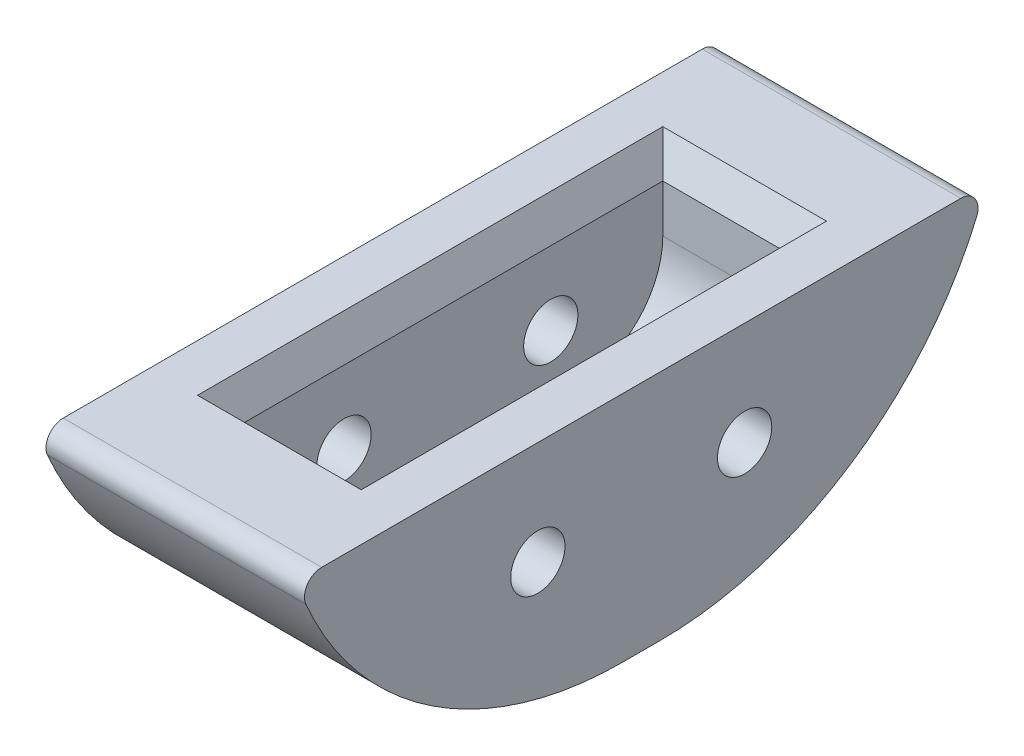
ISO-10303-21;
HEADER;
FILE_DESCRIPTION(('STEP AP214'),'2;1');
FILE_NAME('part.step','',(''),(''),'','','');
FILE_SCHEMA(('AUTOMOTIVE_DESIGN { 1 0 10303 214 1 1 1 1 }'));
ENDSEC;
DATA;
#1=APPLICATION_CONTEXT('core data for automotive mechanical design processes');
#2=APPLICATION_PROTOCOL_DEFINITION('international standard','automotive_design',2000,#1);
#3=PRODUCT_CONTEXT('',#1,'mechanical');
#4=PRODUCT('Part','Part','',(#3));
#5=PRODUCT_RELATED_PRODUCT_CATEGORY('part','',(#4));
#6=PRODUCT_DEFINITION_FORMATION('','',#4);
#7=PRODUCT_DEFINITION_CONTEXT('part definition',#1,'design');
#8=PRODUCT_DEFINITION('design','',#6,#7);
#9=PRODUCT_DEFINITION_SHAPE('','',#8);
#10=(LENGTH_UNIT() NAMED_UNIT(*) SI_UNIT(.MILLI.,.METRE.));
#11=(NAMED_UNIT(*) PLANE_ANGLE_UNIT() SI_UNIT($,.RADIAN.));
#12=(NAMED_UNIT(*) SI_UNIT($,.STERADIAN.) SOLID_ANGLE_UNIT());
#13=UNCERTAINTY_MEASURE_WITH_UNIT(LENGTH_MEASURE(1.E-05),#10,'distance_accuracy_value','');
#14=(GEOMETRIC_REPRESENTATION_CONTEXT(3) GLOBAL_UNCERTAINTY_ASSIGNED_CONTEXT((#13)) GLOBAL_UNIT_ASSIGNED_CONTEXT((#10,
#11,#12)) REPRESENTATION_CONTEXT('',''));
#15=CARTESIAN_POINT('',(0.,0.,0.));
#16=DIRECTION('',(0.,0.,1.));
#17=DIRECTION('',(1.,0.,0.));
#18=AXIS2_PLACEMENT_3D('',#15,#16,#17);
#19=CARTESIAN_POINT('',(-25.,15.,-12.));
#20=DIRECTION('',(1.,0.,0.));
#21=DIRECTION('',(0.,0.,-1.));
#22=AXIS2_PLACEMENT_3D('',#19,#20,#21);
#23=CYLINDRICAL_SURFACE('',#22,3.15);
#24=CARTESIAN_POINT('',(-7.5,15.,-12.));
#25=DIRECTION('',(-1.,0.,0.));
#26=DIRECTION('',(0.,0.,1.));
#27=AXIS2_PLACEMENT_3D('',#24,#25,#26);
#28=CIRCLE('',#27,3.15);
#29=CARTESIAN_POINT('',(-7.5,15.,-8.85));
#30=VERTEX_POINT('',#29);
#31=EDGE_CURVE('E214',#30,#30,#28,.T.);
#32=ORIENTED_EDGE('',*,*,#31,.F.);
#33=EDGE_LOOP('',(#32));
#34=FACE_BOUND('',#33,.T.);
#35=CARTESIAN_POINT('',(-15.,15.,-12.));
#36=DIRECTION('',(-1.,0.,0.));
#37=DIRECTION('',(0.,0.,1.));
#38=AXIS2_PLACEMENT_3D('',#35,#36,#37);
#39=CIRCLE('',#38,3.15);
#40=CARTESIAN_POINT('',(-15.,15.,-8.85));
#41=VERTEX_POINT('',#40);
#42=EDGE_CURVE('E286',#41,#41,#39,.F.);
#43=ORIENTED_EDGE('',*,*,#42,.F.);
#44=EDGE_LOOP('',(#43));
#45=FACE_BOUND('',#44,.T.);
#46=ADVANCED_FACE('F42',(#34,#45),#23,.F.);
#47=CARTESIAN_POINT('',(-25.,15.,12.));
#48=DIRECTION('',(1.,0.,0.));
#49=DIRECTION('',(0.,0.,-1.));
#50=AXIS2_PLACEMENT_3D('',#47,#48,#49);
#51=CYLINDRICAL_SURFACE('',#50,3.15);
#52=CARTESIAN_POINT('',(-7.5,15.,12.));
#53=DIRECTION('',(-1.,0.,0.));
#54=DIRECTION('',(0.,0.,1.));
#55=AXIS2_PLACEMENT_3D('',#52,#53,#54);
#56=CIRCLE('',#55,3.15);
#57=CARTESIAN_POINT('',(-7.5,15.,15.15));
#58=VERTEX_POINT('',#57);
#59=EDGE_CURVE('E211',#58,#58,#56,.F.);
#60=ORIENTED_EDGE('',*,*,#59,.T.);
#61=EDGE_LOOP('',(#60));
#62=FACE_BOUND('',#61,.T.);
#63=CARTESIAN_POINT('',(-15.,15.,12.));
#64=DIRECTION('',(-1.,0.,0.));
#65=DIRECTION('',(0.,0.,1.));
#66=AXIS2_PLACEMENT_3D('',#63,#64,#65);
#67=CIRCLE('',#66,3.15);
#68=CARTESIAN_POINT('',(-15.,15.,15.15));
#69=VERTEX_POINT('',#68);
#70=EDGE_CURVE('E182',#69,#69,#67,.T.);
#71=ORIENTED_EDGE('',*,*,#70,.T.);
#72=EDGE_LOOP('',(#71));
#73=FACE_BOUND('',#72,.T.);
#74=ADVANCED_FACE('F296',(#62,#73),#51,.F.);
#75=CARTESIAN_POINT('',(15.,27.,40.));
#76=DIRECTION('',(-1.,0.,0.));
#77=DIRECTION('',(0.,0.,1.));
#78=AXIS2_PLACEMENT_3D('',#75,#76,#77);
#79=PLANE('',#78);
#80=DIRECTION('',(0.,0.,-1.));
#81=VECTOR('',#80,1.);
#82=CARTESIAN_POINT('',(15.,27.,40.));
#83=LINE('',#82,#81);
#84=CARTESIAN_POINT('',(15.,27.,37.0856198614367));
#85=VERTEX_POINT('',#84);
#86=CARTESIAN_POINT('',(15.,27.,-37.0856198614367));
#87=VERTEX_POINT('',#86);
#88=EDGE_CURVE('E171',#85,#87,#83,.T.);
#89=ORIENTED_EDGE('',*,*,#88,.F.);
#90=CARTESIAN_POINT('',(15.,25.,37.0856198614367));
#91=DIRECTION('',(-1.,0.,0.));
#92=DIRECTION('',(0.,0.,1.));
#93=AXIS2_PLACEMENT_3D('',#90,#91,#92);
#94=CIRCLE('',#93,2.);
#95=CARTESIAN_POINT('',(15.,24.2105263157895,38.9232083088152));
#96=VERTEX_POINT('',#95);
#97=EDGE_CURVE('E199',#85,#96,#94,.F.);
#98=ORIENTED_EDGE('',*,*,#97,.T.);
#99=CARTESIAN_POINT('',(15.,40.,2.17143936124452));
#100=DIRECTION('',(-1.,0.,0.));
#101=DIRECTION('',(0.,0.,1.));
#102=AXIS2_PLACEMENT_3D('',#99,#100,#101);
#103=CIRCLE('',#102,40.);
#104=CARTESIAN_POINT('',(15.,0.,2.17143936124452));
#105=VERTEX_POINT('',#104);
#106=EDGE_CURVE('E161',#96,#105,#103,.F.);
#107=ORIENTED_EDGE('',*,*,#106,.T.);
#108=DIRECTION('',(0.,0.,-1.));
#109=VECTOR('',#108,1.);
#110=CARTESIAN_POINT('',(15.,0.,40.));
#111=LINE('',#110,#109);
#112=CARTESIAN_POINT('',(15.,0.,-2.17143936124452));
#113=VERTEX_POINT('',#112);
#114=EDGE_CURVE('E172',#105,#113,#111,.T.);
#115=ORIENTED_EDGE('',*,*,#114,.T.);
#116=CARTESIAN_POINT('',(15.,40.,-2.17143936124452));
#117=DIRECTION('',(-1.,0.,0.));
#118=DIRECTION('',(0.,0.,1.));
#119=AXIS2_PLACEMENT_3D('',#116,#117,#118);
#120=CIRCLE('',#119,40.);
#121=CARTESIAN_POINT('',(15.,24.2105263157895,-38.9232083088152));
#122=VERTEX_POINT('',#121);
#123=EDGE_CURVE('E162',#113,#122,#120,.F.);
#124=ORIENTED_EDGE('',*,*,#123,.T.);
#125=CARTESIAN_POINT('',(15.,25.,-37.0856198614367));
#126=DIRECTION('',(-1.,0.,0.));
#127=DIRECTION('',(0.,0.,1.));
#128=AXIS2_PLACEMENT_3D('',#125,#126,#127);
#129=CIRCLE('',#128,2.);
#130=EDGE_CURVE('E191',#122,#87,#129,.F.);
#131=ORIENTED_EDGE('',*,*,#130,.T.);
#132=EDGE_LOOP('',(#89,#98,#107,#115,#124,#131));
#133=FACE_BOUND('',#132,.T.);
#134=CARTESIAN_POINT('',(15.,15.,-12.));
#135=DIRECTION('',(-1.,0.,0.));
#136=DIRECTION('',(0.,0.,1.));
#137=AXIS2_PLACEMENT_3D('',#134,#135,#136);
#138=CIRCLE('',#137,3.15);
#139=CARTESIAN_POINT('',(15.,15.,-8.85));
#140=VERTEX_POINT('',#139);
#141=EDGE_CURVE('E282',#140,#140,#138,.T.);
#142=ORIENTED_EDGE('',*,*,#141,.T.);
#143=EDGE_LOOP('',(#142));
#144=FACE_BOUND('',#143,.T.);
#145=CARTESIAN_POINT('',(15.,15.,12.));
#146=DIRECTION('',(1.,0.,0.));
#147=DIRECTION('',(0.,0.,-1.));
#148=AXIS2_PLACEMENT_3D('',#145,#146,#147);
#149=CIRCLE('',#148,3.15);
#150=CARTESIAN_POINT('',(15.,15.,8.85));
#151=VERTEX_POINT('',#150);
#152=EDGE_CURVE('E283',#151,#151,#149,.T.);
#153=ORIENTED_EDGE('',*,*,#152,.F.);
#154=EDGE_LOOP('',(#153));
#155=FACE_BOUND('',#154,.T.);
#156=ADVANCED_FACE('F300',(#133,#144,#155),#79,.F.);
#157=CARTESIAN_POINT('',(-15.,27.,40.));
#158=DIRECTION('',(-1.,0.,0.));
#159=DIRECTION('',(0.,0.,1.));
#160=AXIS2_PLACEMENT_3D('',#157,#158,#159);
#161=PLANE('',#160);
#162=CARTESIAN_POINT('',(-15.,25.,37.0856198614367));
#163=DIRECTION('',(-1.,0.,0.));
#164=DIRECTION('',(0.,0.,1.));
#165=AXIS2_PLACEMENT_3D('',#162,#163,#164);
#166=CIRCLE('',#165,2.);
#167=CARTESIAN_POINT('',(-15.,24.2105263157895,38.9232083088152));
#168=VERTEX_POINT('',#167);
#169=CARTESIAN_POINT('',(-15.,27.,37.0856198614367));
#170=VERTEX_POINT('',#169);
#171=EDGE_CURVE('E203',#168,#170,#166,.T.);
#172=ORIENTED_EDGE('',*,*,#171,.T.);
#173=DIRECTION('',(0.,0.,-1.));
#174=VECTOR('',#173,1.);
#175=CARTESIAN_POINT('',(-15.,27.,40.));
#176=LINE('',#175,#174);
#177=CARTESIAN_POINT('',(-15.,27.,-37.0856198614367));
#178=VERTEX_POINT('',#177);
#179=EDGE_CURVE('E177',#170,#178,#176,.T.);
#180=ORIENTED_EDGE('',*,*,#179,.T.);
#181=CARTESIAN_POINT('',(-15.,25.,-37.0856198614367));
#182=DIRECTION('',(-1.,0.,0.));
#183=DIRECTION('',(0.,0.,1.));
#184=AXIS2_PLACEMENT_3D('',#181,#182,#183);
#185=CIRCLE('',#184,2.);
#186=CARTESIAN_POINT('',(-15.,24.2105263157895,-38.9232083088152));
#187=VERTEX_POINT('',#186);
#188=EDGE_CURVE('E156',#178,#187,#185,.T.);
#189=ORIENTED_EDGE('',*,*,#188,.T.);
#190=CARTESIAN_POINT('',(-15.,40.,-2.17143936124452));
#191=DIRECTION('',(-1.,0.,0.));
#192=DIRECTION('',(0.,0.,1.));
#193=AXIS2_PLACEMENT_3D('',#190,#191,#192);
#194=CIRCLE('',#193,40.);
#195=CARTESIAN_POINT('',(-15.,0.,-2.17143936124452));
#196=VERTEX_POINT('',#195);
#197=EDGE_CURVE('E146',#187,#196,#194,.T.);
#198=ORIENTED_EDGE('',*,*,#197,.T.);
#199=DIRECTION('',(0.,0.,-1.));
#200=VECTOR('',#199,1.);
#201=CARTESIAN_POINT('',(-15.,0.,40.));
#202=LINE('',#201,#200);
#203=CARTESIAN_POINT('',(-15.,0.,2.17143936124452));
#204=VERTEX_POINT('',#203);
#205=EDGE_CURVE('E152',#204,#196,#202,.T.);
#206=ORIENTED_EDGE('',*,*,#205,.F.);
#207=CARTESIAN_POINT('',(-15.,40.,2.17143936124452));
#208=DIRECTION('',(-1.,0.,0.));
#209=DIRECTION('',(0.,0.,1.));
#210=AXIS2_PLACEMENT_3D('',#207,#208,#209);
#211=CIRCLE('',#210,40.);
#212=EDGE_CURVE('E187',#204,#168,#211,.T.);
#213=ORIENTED_EDGE('',*,*,#212,.T.);
#214=EDGE_LOOP('',(#172,#180,#189,#198,#206,#213));
#215=FACE_BOUND('',#214,.T.);
#216=ORIENTED_EDGE('',*,*,#42,.T.);
#217=EDGE_LOOP('',(#216));
#218=FACE_BOUND('',#217,.T.);
#219=ORIENTED_EDGE('',*,*,#70,.F.);
#220=EDGE_LOOP('',(#219));
#221=FACE_BOUND('',#220,.T.);
#222=ADVANCED_FACE('F149',(#215,#218,#221),#161,.T.);
#223=CARTESIAN_POINT('',(0.,27.,0.));
#224=DIRECTION('',(0.,1.,0.));
#225=DIRECTION('',(0.,0.,1.));
#226=AXIS2_PLACEMENT_3D('',#223,#224,#225);
#227=PLANE('',#226);
#228=DIRECTION('',(0.,0.,-1.));
#229=VECTOR('',#228,1.);
#230=CARTESIAN_POINT('',(-9.50000000000001,27.,-25.));
#231=LINE('',#230,#229);
#232=CARTESIAN_POINT('',(-9.50000000000001,27.,27.));
#233=VERTEX_POINT('',#232);
#234=CARTESIAN_POINT('',(-9.50000000000001,27.,-27.));
#235=VERTEX_POINT('',#234);
#236=EDGE_CURVE('E237',#233,#235,#231,.T.);
#237=ORIENTED_EDGE('',*,*,#236,.T.);
#238=DIRECTION('',(1.,0.,0.));
#239=VECTOR('',#238,1.);
#240=CARTESIAN_POINT('',(7.5,27.,-27.));
#241=LINE('',#240,#239);
#242=CARTESIAN_POINT('',(9.5,27.,-27.));
#243=VERTEX_POINT('',#242);
#244=EDGE_CURVE('E241',#235,#243,#241,.T.);
#245=ORIENTED_EDGE('',*,*,#244,.T.);
#246=DIRECTION('',(0.,0.,1.));
#247=VECTOR('',#246,1.);
#248=CARTESIAN_POINT('',(9.5,27.,25.));
#249=LINE('',#248,#247);
#250=CARTESIAN_POINT('',(9.5,27.,27.));
#251=VERTEX_POINT('',#250);
#252=EDGE_CURVE('E239',#243,#251,#249,.T.);
#253=ORIENTED_EDGE('',*,*,#252,.T.);
#254=DIRECTION('',(-1.,0.,0.));
#255=VECTOR('',#254,1.);
#256=CARTESIAN_POINT('',(-7.5,27.,27.));
#257=LINE('',#256,#255);
#258=EDGE_CURVE('E235',#251,#233,#257,.T.);
#259=ORIENTED_EDGE('',*,*,#258,.T.);
#260=EDGE_LOOP('',(#237,#245,#253,#259));
#261=FACE_BOUND('',#260,.T.);
#262=ORIENTED_EDGE('',*,*,#88,.T.);
#263=DIRECTION('',(1.,0.,0.));
#264=VECTOR('',#263,1.);
#265=CARTESIAN_POINT('',(0.,27.,-37.0856198614367));
#266=LINE('',#265,#264);
#267=EDGE_CURVE('E193',#87,#178,#266,.F.);
#268=ORIENTED_EDGE('',*,*,#267,.T.);
#269=ORIENTED_EDGE('',*,*,#179,.F.);
#270=DIRECTION('',(1.,0.,0.));
#271=VECTOR('',#270,1.);
#272=CARTESIAN_POINT('',(0.,27.,37.0856198614367));
#273=LINE('',#272,#271);
#274=EDGE_CURVE('E196',#170,#85,#273,.T.);
#275=ORIENTED_EDGE('',*,*,#274,.T.);
#276=EDGE_LOOP('',(#262,#268,#269,#275));
#277=FACE_BOUND('',#276,.T.);
#278=ADVANCED_FACE('F299',(#261,#277),#227,.T.);
#279=CARTESIAN_POINT('',(0.,0.,0.));
#280=DIRECTION('',(0.,1.,0.));
#281=DIRECTION('',(0.,0.,1.));
#282=AXIS2_PLACEMENT_3D('',#279,#280,#281);
#283=PLANE('',#282);
#284=ORIENTED_EDGE('',*,*,#114,.F.);
#285=DIRECTION('',(1.,0.,0.));
#286=VECTOR('',#285,1.);
#287=CARTESIAN_POINT('',(0.,0.,2.17143936124452));
#288=LINE('',#287,#286);
#289=EDGE_CURVE('E170',#105,#204,#288,.F.);
#290=ORIENTED_EDGE('',*,*,#289,.T.);
#291=ORIENTED_EDGE('',*,*,#205,.T.);
#292=DIRECTION('',(1.,0.,0.));
#293=VECTOR('',#292,1.);
#294=CARTESIAN_POINT('',(0.,0.,-2.17143936124452));
#295=LINE('',#294,#293);
#296=EDGE_CURVE('E168',#196,#113,#295,.T.);
#297=ORIENTED_EDGE('',*,*,#296,.T.);
#298=EDGE_LOOP('',(#284,#290,#291,#297));
#299=FACE_BOUND('',#298,.T.);
#300=ADVANCED_FACE('F167',(#299),#283,.F.);
#301=CARTESIAN_POINT('',(7.5,15.,-12.));
#302=DIRECTION('',(1.,0.,0.));
#303=DIRECTION('',(0.,0.,-1.));
#304=AXIS2_PLACEMENT_3D('',#301,#302,#303);
#305=CIRCLE('',#304,3.15);
#306=CARTESIAN_POINT('',(7.5,15.,-15.15));
#307=VERTEX_POINT('',#306);
#308=EDGE_CURVE('E209',#307,#307,#305,.T.);
#309=ORIENTED_EDGE('',*,*,#308,.F.);
#310=EDGE_LOOP('',(#309));
#311=FACE_BOUND('',#310,.T.);
#312=ORIENTED_EDGE('',*,*,#141,.F.);
#313=EDGE_LOOP('',(#312));
#314=FACE_BOUND('',#313,.T.);
#315=ADVANCED_FACE('F314',(#311,#314),#23,.F.);
#316=CARTESIAN_POINT('',(7.5,15.,12.));
#317=DIRECTION('',(1.,0.,0.));
#318=DIRECTION('',(0.,0.,-1.));
#319=AXIS2_PLACEMENT_3D('',#316,#317,#318);
#320=CIRCLE('',#319,3.15);
#321=CARTESIAN_POINT('',(7.5,15.,8.85));
#322=VERTEX_POINT('',#321);
#323=EDGE_CURVE('E206',#322,#322,#320,.F.);
#324=ORIENTED_EDGE('',*,*,#323,.T.);
#325=EDGE_LOOP('',(#324));
#326=FACE_BOUND('',#325,.T.);
#327=ORIENTED_EDGE('',*,*,#152,.T.);
#328=EDGE_LOOP('',(#327));
#329=FACE_BOUND('',#328,.T.);
#330=ADVANCED_FACE('F320',(#326,#329),#51,.F.);
#331=CARTESIAN_POINT('',(-15.,40.,-2.17143936124452));
#332=DIRECTION('',(1.,0.,0.));
#333=DIRECTION('',(0.,0.,-1.));
#334=AXIS2_PLACEMENT_3D('',#331,#332,#333);
#335=CYLINDRICAL_SURFACE('',#334,40.);
#336=ORIENTED_EDGE('',*,*,#197,.F.);
#337=DIRECTION('',(1.,0.,0.));
#338=VECTOR('',#337,1.);
#339=CARTESIAN_POINT('',(-15.,24.2105263157895,-38.9232083088152));
#340=LINE('',#339,#338);
#341=EDGE_CURVE('E189',#187,#122,#340,.T.);
#342=ORIENTED_EDGE('',*,*,#341,.T.);
#343=ORIENTED_EDGE('',*,*,#123,.F.);
#344=ORIENTED_EDGE('',*,*,#296,.F.);
#345=EDGE_LOOP('',(#336,#342,#343,#344));
#346=FACE_BOUND('',#345,.T.);
#347=ADVANCED_FACE('F175',(#346),#335,.T.);
#348=CARTESIAN_POINT('',(-15.,40.,2.17143936124452));
#349=DIRECTION('',(1.,0.,0.));
#350=DIRECTION('',(0.,0.,-1.));
#351=AXIS2_PLACEMENT_3D('',#348,#349,#350);
#352=CYLINDRICAL_SURFACE('',#351,40.);
#353=ORIENTED_EDGE('',*,*,#106,.F.);
#354=DIRECTION('',(1.,0.,0.));
#355=VECTOR('',#354,1.);
#356=CARTESIAN_POINT('',(-15.,24.2105263157895,38.9232083088152));
#357=LINE('',#356,#355);
#358=EDGE_CURVE('E201',#96,#168,#357,.F.);
#359=ORIENTED_EDGE('',*,*,#358,.T.);
#360=ORIENTED_EDGE('',*,*,#212,.F.);
#361=ORIENTED_EDGE('',*,*,#289,.F.);
#362=EDGE_LOOP('',(#353,#359,#360,#361));
#363=FACE_BOUND('',#362,.T.);
#364=ADVANCED_FACE('F392',(#363),#352,.T.);
#365=CARTESIAN_POINT('',(-15.,25.,-37.0856198614367));
#366=DIRECTION('',(1.,0.,0.));
#367=DIRECTION('',(0.,0.,-1.));
#368=AXIS2_PLACEMENT_3D('',#365,#366,#367);
#369=CYLINDRICAL_SURFACE('',#368,2.);
#370=ORIENTED_EDGE('',*,*,#188,.F.);
#371=ORIENTED_EDGE('',*,*,#267,.F.);
#372=ORIENTED_EDGE('',*,*,#130,.F.);
#373=ORIENTED_EDGE('',*,*,#341,.F.);
#374=EDGE_LOOP('',(#370,#371,#372,#373));
#375=FACE_BOUND('',#374,.T.);
#376=ADVANCED_FACE('F386',(#375),#369,.T.);
#377=CARTESIAN_POINT('',(-15.,25.,37.0856198614367));
#378=DIRECTION('',(1.,0.,0.));
#379=DIRECTION('',(0.,0.,-1.));
#380=AXIS2_PLACEMENT_3D('',#377,#378,#379);
#381=CYLINDRICAL_SURFACE('',#380,2.);
#382=ORIENTED_EDGE('',*,*,#171,.F.);
#383=ORIENTED_EDGE('',*,*,#358,.F.);
#384=ORIENTED_EDGE('',*,*,#97,.F.);
#385=ORIENTED_EDGE('',*,*,#274,.F.);
#386=EDGE_LOOP('',(#382,#383,#384,#385));
#387=FACE_BOUND('',#386,.T.);
#388=ADVANCED_FACE('F381',(#387),#381,.T.);
#389=CARTESIAN_POINT('',(-7.5,8.,25.));
#390=DIRECTION('',(-1.,0.,0.));
#391=DIRECTION('',(0.,0.,1.));
#392=AXIS2_PLACEMENT_3D('',#389,#390,#391);
#393=PLANE('',#392);
#394=ORIENTED_EDGE('',*,*,#31,.T.);
#395=EDGE_LOOP('',(#394));
#396=FACE_BOUND('',#395,.T.);
#397=DIRECTION('',(0.,1.,0.));
#398=VECTOR('',#397,1.);
#399=CARTESIAN_POINT('',(-7.5,8.,-25.));
#400=LINE('',#399,#398);
#401=CARTESIAN_POINT('',(-7.5,18.,-25.));
#402=VERTEX_POINT('',#401);
#403=CARTESIAN_POINT('',(-7.5,23.5358983848623,-25.));
#404=VERTEX_POINT('',#403);
#405=EDGE_CURVE('E210',#402,#404,#400,.T.);
#406=ORIENTED_EDGE('',*,*,#405,.T.);
#407=DIRECTION('',(0.,0.,1.));
#408=VECTOR('',#407,1.);
#409=CARTESIAN_POINT('',(-7.5,23.5358983848623,25.));
#410=LINE('',#409,#408);
#411=CARTESIAN_POINT('',(-7.5,23.5358983848623,25.));
#412=VERTEX_POINT('',#411);
#413=EDGE_CURVE('E52',#404,#412,#410,.T.);
#414=ORIENTED_EDGE('',*,*,#413,.T.);
#415=DIRECTION('',(0.,1.,0.));
#416=VECTOR('',#415,1.);
#417=CARTESIAN_POINT('',(-7.5,8.,25.));
#418=LINE('',#417,#416);
#419=CARTESIAN_POINT('',(-7.5,18.,25.));
#420=VERTEX_POINT('',#419);
#421=EDGE_CURVE('E268',#420,#412,#418,.T.);
#422=ORIENTED_EDGE('',*,*,#421,.F.);
#423=CARTESIAN_POINT('',(-7.5,18.,15.));
#424=DIRECTION('',(-1.,0.,0.));
#425=DIRECTION('',(0.,0.,1.));
#426=AXIS2_PLACEMENT_3D('',#423,#424,#425);
#427=CIRCLE('',#426,10.);
#428=CARTESIAN_POINT('',(-7.5,8.,15.));
#429=VERTEX_POINT('',#428);
#430=EDGE_CURVE('E220',#420,#429,#427,.F.);
#431=ORIENTED_EDGE('',*,*,#430,.T.);
#432=DIRECTION('',(0.,0.,1.));
#433=VECTOR('',#432,1.);
#434=CARTESIAN_POINT('',(-7.5,8.,25.));
#435=LINE('',#434,#433);
#436=CARTESIAN_POINT('',(-7.5,8.,-15.));
#437=VERTEX_POINT('',#436);
#438=EDGE_CURVE('E256',#437,#429,#435,.T.);
#439=ORIENTED_EDGE('',*,*,#438,.F.);
#440=CARTESIAN_POINT('',(-7.5,18.,-15.));
#441=DIRECTION('',(-1.,0.,0.));
#442=DIRECTION('',(0.,0.,1.));
#443=AXIS2_PLACEMENT_3D('',#440,#441,#442);
#444=CIRCLE('',#443,10.);
#445=EDGE_CURVE('E222',#437,#402,#444,.F.);
#446=ORIENTED_EDGE('',*,*,#445,.T.);
#447=EDGE_LOOP('',(#406,#414,#422,#431,#439,#446));
#448=FACE_BOUND('',#447,.T.);
#449=ORIENTED_EDGE('',*,*,#59,.F.);
#450=EDGE_LOOP('',(#449));
#451=FACE_BOUND('',#450,.T.);
#452=ADVANCED_FACE('F342',(#396,#448,#451),#393,.F.);
#453=CARTESIAN_POINT('',(7.5,8.,25.));
#454=DIRECTION('',(1.,0.,0.));
#455=DIRECTION('',(0.,0.,-1.));
#456=AXIS2_PLACEMENT_3D('',#453,#454,#455);
#457=PLANE('',#456);
#458=ORIENTED_EDGE('',*,*,#308,.T.);
#459=EDGE_LOOP('',(#458));
#460=FACE_BOUND('',#459,.T.);
#461=DIRECTION('',(0.,1.,0.));
#462=VECTOR('',#461,1.);
#463=CARTESIAN_POINT('',(7.5,8.,25.));
#464=LINE('',#463,#462);
#465=CARTESIAN_POINT('',(7.5,18.,25.));
#466=VERTEX_POINT('',#465);
#467=CARTESIAN_POINT('',(7.5,23.5358983848623,25.));
#468=VERTEX_POINT('',#467);
#469=EDGE_CURVE('E275',#466,#468,#464,.T.);
#470=ORIENTED_EDGE('',*,*,#469,.T.);
#471=DIRECTION('',(0.,0.,-1.));
#472=VECTOR('',#471,1.);
#473=CARTESIAN_POINT('',(7.5,23.5358983848623,-25.));
#474=LINE('',#473,#472);
#475=CARTESIAN_POINT('',(7.5,23.5358983848623,-25.));
#476=VERTEX_POINT('',#475);
#477=EDGE_CURVE('E244',#468,#476,#474,.T.);
#478=ORIENTED_EDGE('',*,*,#477,.T.);
#479=DIRECTION('',(0.,1.,0.));
#480=VECTOR('',#479,1.);
#481=CARTESIAN_POINT('',(7.5,8.,-25.));
#482=LINE('',#481,#480);
#483=CARTESIAN_POINT('',(7.5,18.,-25.));
#484=VERTEX_POINT('',#483);
#485=EDGE_CURVE('E272',#484,#476,#482,.T.);
#486=ORIENTED_EDGE('',*,*,#485,.F.);
#487=CARTESIAN_POINT('',(7.5,18.,-15.));
#488=DIRECTION('',(1.,0.,0.));
#489=DIRECTION('',(0.,0.,-1.));
#490=AXIS2_PLACEMENT_3D('',#487,#488,#489);
#491=CIRCLE('',#490,10.);
#492=CARTESIAN_POINT('',(7.5,8.,-15.));
#493=VERTEX_POINT('',#492);
#494=EDGE_CURVE('E228',#484,#493,#491,.F.);
#495=ORIENTED_EDGE('',*,*,#494,.T.);
#496=DIRECTION('',(0.,0.,-1.));
#497=VECTOR('',#496,1.);
#498=CARTESIAN_POINT('',(7.5,8.,25.));
#499=LINE('',#498,#497);
#500=CARTESIAN_POINT('',(7.5,8.,15.));
#501=VERTEX_POINT('',#500);
#502=EDGE_CURVE('E262',#501,#493,#499,.T.);
#503=ORIENTED_EDGE('',*,*,#502,.F.);
#504=CARTESIAN_POINT('',(7.5,18.,15.));
#505=DIRECTION('',(1.,0.,0.));
#506=DIRECTION('',(0.,0.,-1.));
#507=AXIS2_PLACEMENT_3D('',#504,#505,#506);
#508=CIRCLE('',#507,10.);
#509=EDGE_CURVE('E226',#501,#466,#508,.F.);
#510=ORIENTED_EDGE('',*,*,#509,.T.);
#511=EDGE_LOOP('',(#470,#478,#486,#495,#503,#510));
#512=FACE_BOUND('',#511,.T.);
#513=ORIENTED_EDGE('',*,*,#323,.F.);
#514=EDGE_LOOP('',(#513));
#515=FACE_BOUND('',#514,.T.);
#516=ADVANCED_FACE('F338',(#460,#512,#515),#457,.F.);
#517=CARTESIAN_POINT('',(7.5,8.,-25.));
#518=DIRECTION('',(0.,0.,-1.));
#519=DIRECTION('',(-1.,0.,0.));
#520=AXIS2_PLACEMENT_3D('',#517,#518,#519);
#521=PLANE('',#520);
#522=ORIENTED_EDGE('',*,*,#485,.T.);
#523=DIRECTION('',(-1.,0.,0.));
#524=VECTOR('',#523,1.);
#525=CARTESIAN_POINT('',(-7.5,23.5358983848623,-25.));
#526=LINE('',#525,#524);
#527=EDGE_CURVE('E232',#476,#404,#526,.T.);
#528=ORIENTED_EDGE('',*,*,#527,.T.);
#529=ORIENTED_EDGE('',*,*,#405,.F.);
#530=DIRECTION('',(-1.,0.,0.));
#531=VECTOR('',#530,1.);
#532=CARTESIAN_POINT('',(7.5,18.,-25.));
#533=LINE('',#532,#531);
#534=EDGE_CURVE('E224',#402,#484,#533,.F.);
#535=ORIENTED_EDGE('',*,*,#534,.T.);
#536=EDGE_LOOP('',(#522,#528,#529,#535));
#537=FACE_BOUND('',#536,.T.);
#538=ADVANCED_FACE('F341',(#537),#521,.F.);
#539=CARTESIAN_POINT('',(7.5,8.,25.));
#540=DIRECTION('',(0.,0.,1.));
#541=DIRECTION('',(1.,0.,0.));
#542=AXIS2_PLACEMENT_3D('',#539,#540,#541);
#543=PLANE('',#542);
#544=ORIENTED_EDGE('',*,*,#421,.T.);
#545=DIRECTION('',(1.,0.,0.));
#546=VECTOR('',#545,1.);
#547=CARTESIAN_POINT('',(7.5,23.5358983848623,25.));
#548=LINE('',#547,#546);
#549=EDGE_CURVE('E11',#412,#468,#548,.T.);
#550=ORIENTED_EDGE('',*,*,#549,.T.);
#551=ORIENTED_EDGE('',*,*,#469,.F.);
#552=DIRECTION('',(1.,0.,0.));
#553=VECTOR('',#552,1.);
#554=CARTESIAN_POINT('',(7.5,18.,25.));
#555=LINE('',#554,#553);
#556=EDGE_CURVE('E230',#466,#420,#555,.F.);
#557=ORIENTED_EDGE('',*,*,#556,.T.);
#558=EDGE_LOOP('',(#544,#550,#551,#557));
#559=FACE_BOUND('',#558,.T.);
#560=ADVANCED_FACE('F370',(#559),#543,.F.);
#561=CARTESIAN_POINT('',(0.,8.,0.));
#562=DIRECTION('',(0.,1.,0.));
#563=DIRECTION('',(0.,0.,1.));
#564=AXIS2_PLACEMENT_3D('',#561,#562,#563);
#565=PLANE('',#564);
#566=ORIENTED_EDGE('',*,*,#502,.T.);
#567=DIRECTION('',(-1.,0.,0.));
#568=VECTOR('',#567,1.);
#569=CARTESIAN_POINT('',(0.,8.,-15.));
#570=LINE('',#569,#568);
#571=EDGE_CURVE('E217',#493,#437,#570,.T.);
#572=ORIENTED_EDGE('',*,*,#571,.T.);
#573=ORIENTED_EDGE('',*,*,#438,.T.);
#574=DIRECTION('',(1.,0.,0.));
#575=VECTOR('',#574,1.);
#576=CARTESIAN_POINT('',(0.,8.,15.));
#577=LINE('',#576,#575);
#578=EDGE_CURVE('E205',#429,#501,#577,.T.);
#579=ORIENTED_EDGE('',*,*,#578,.T.);
#580=EDGE_LOOP('',(#566,#572,#573,#579));
#581=FACE_BOUND('',#580,.T.);
#582=ADVANCED_FACE('F366',(#581),#565,.T.);
#583=CARTESIAN_POINT('',(0.,18.,-15.));
#584=DIRECTION('',(-1.,0.,0.));
#585=DIRECTION('',(0.,0.,1.));
#586=AXIS2_PLACEMENT_3D('',#583,#584,#585);
#587=CYLINDRICAL_SURFACE('',#586,10.);
#588=ORIENTED_EDGE('',*,*,#494,.F.);
#589=ORIENTED_EDGE('',*,*,#534,.F.);
#590=ORIENTED_EDGE('',*,*,#445,.F.);
#591=ORIENTED_EDGE('',*,*,#571,.F.);
#592=EDGE_LOOP('',(#588,#589,#590,#591));
#593=FACE_BOUND('',#592,.T.);
#594=ADVANCED_FACE('F365',(#593),#587,.F.);
#595=CARTESIAN_POINT('',(0.,18.,15.));
#596=DIRECTION('',(1.,0.,0.));
#597=DIRECTION('',(0.,0.,-1.));
#598=AXIS2_PLACEMENT_3D('',#595,#596,#597);
#599=CYLINDRICAL_SURFACE('',#598,10.);
#600=ORIENTED_EDGE('',*,*,#430,.F.);
#601=ORIENTED_EDGE('',*,*,#556,.F.);
#602=ORIENTED_EDGE('',*,*,#509,.F.);
#603=ORIENTED_EDGE('',*,*,#578,.F.);
#604=EDGE_LOOP('',(#600,#601,#602,#603));
#605=FACE_BOUND('',#604,.T.);
#606=ADVANCED_FACE('F369',(#605),#599,.F.);
#607=CARTESIAN_POINT('',(7.5,23.5358983848623,25.));
#608=DIRECTION('',(0.,0.500000000000002,-0.866025403784438));
#609=DIRECTION('',(-1.,0.,0.));
#610=AXIS2_PLACEMENT_3D('',#607,#608,#609);
#611=PLANE('',#610);
#612=DIRECTION('',(-0.447213595499959,0.774596669241482,0.447213595499959));
#613=VECTOR('',#612,1.);
#614=CARTESIAN_POINT('',(-7.5,23.5358983848623,25.));
#615=LINE('',#614,#613);
#616=EDGE_CURVE('E250',#233,#412,#615,.F.);
#617=ORIENTED_EDGE('',*,*,#616,.F.);
#618=ORIENTED_EDGE('',*,*,#258,.F.);
#619=DIRECTION('',(-0.447213595499959,-0.774596669241482,-0.447213595499959));
#620=VECTOR('',#619,1.);
#621=CARTESIAN_POINT('',(7.5,23.5358983848623,25.));
#622=LINE('',#621,#620);
#623=EDGE_CURVE('E47',#468,#251,#622,.F.);
#624=ORIENTED_EDGE('',*,*,#623,.F.);
#625=ORIENTED_EDGE('',*,*,#549,.F.);
#626=EDGE_LOOP('',(#617,#618,#624,#625));
#627=FACE_BOUND('',#626,.T.);
#628=ADVANCED_FACE('F45',(#627),#611,.T.);
#629=CARTESIAN_POINT('',(7.5,23.5358983848623,25.));
#630=DIRECTION('',(-0.866025403784438,0.500000000000001,0.));
#631=DIRECTION('',(0.,0.,1.));
#632=AXIS2_PLACEMENT_3D('',#629,#630,#631);
#633=PLANE('',#632);
#634=ORIENTED_EDGE('',*,*,#623,.T.);
#635=ORIENTED_EDGE('',*,*,#252,.F.);
#636=DIRECTION('',(-0.447213595499959,-0.774596669241482,0.447213595499959));
#637=VECTOR('',#636,1.);
#638=CARTESIAN_POINT('',(7.5,23.5358983848623,-25.));
#639=LINE('',#638,#637);
#640=EDGE_CURVE('E249',#476,#243,#639,.F.);
#641=ORIENTED_EDGE('',*,*,#640,.F.);
#642=ORIENTED_EDGE('',*,*,#477,.F.);
#643=EDGE_LOOP('',(#634,#635,#641,#642));
#644=FACE_BOUND('',#643,.T.);
#645=ADVANCED_FACE('F352',(#644),#633,.T.);
#646=CARTESIAN_POINT('',(-7.5,23.5358983848623,25.));
#647=DIRECTION('',(0.866025403784438,0.500000000000002,0.));
#648=DIRECTION('',(0.,0.,-1.));
#649=AXIS2_PLACEMENT_3D('',#646,#647,#648);
#650=PLANE('',#649);
#651=ORIENTED_EDGE('',*,*,#616,.T.);
#652=ORIENTED_EDGE('',*,*,#413,.F.);
#653=DIRECTION('',(-0.447213595499959,0.774596669241482,-0.447213595499959));
#654=VECTOR('',#653,1.);
#655=CARTESIAN_POINT('',(-4.49999999999999,18.3397459621556,-22.));
#656=LINE('',#655,#654);
#657=EDGE_CURVE('E247',#235,#404,#656,.F.);
#658=ORIENTED_EDGE('',*,*,#657,.F.);
#659=ORIENTED_EDGE('',*,*,#236,.F.);
#660=EDGE_LOOP('',(#651,#652,#658,#659));
#661=FACE_BOUND('',#660,.T.);
#662=ADVANCED_FACE('F408',(#661),#650,.T.);
#663=CARTESIAN_POINT('',(7.5,23.5358983848623,-25.));
#664=DIRECTION('',(0.,0.500000000000002,0.866025403784438));
#665=DIRECTION('',(1.,0.,0.));
#666=AXIS2_PLACEMENT_3D('',#663,#664,#665);
#667=PLANE('',#666);
#668=ORIENTED_EDGE('',*,*,#640,.T.);
#669=ORIENTED_EDGE('',*,*,#244,.F.);
#670=ORIENTED_EDGE('',*,*,#657,.T.);
#671=ORIENTED_EDGE('',*,*,#527,.F.);
#672=EDGE_LOOP('',(#668,#669,#670,#671));
#673=FACE_BOUND('',#672,.T.);
#674=ADVANCED_FACE('F356',(#673),#667,.T.);
#675=CLOSED_SHELL('',(#46,#74,#156,#222,#278,#300,#315,#330,#347,#364,#376,#388,#452,#516,#538,
#560,#582,#594,#606,#628,#645,#662,#674));
#676=MANIFOLD_SOLID_BREP('B2',#675);
#677=ADVANCED_BREP_SHAPE_REPRESENTATION('',(#18,#676),#14);
#678=SHAPE_DEFINITION_REPRESENTATION(#9,#677);
ENDSEC;
END-ISO-10303-21;
